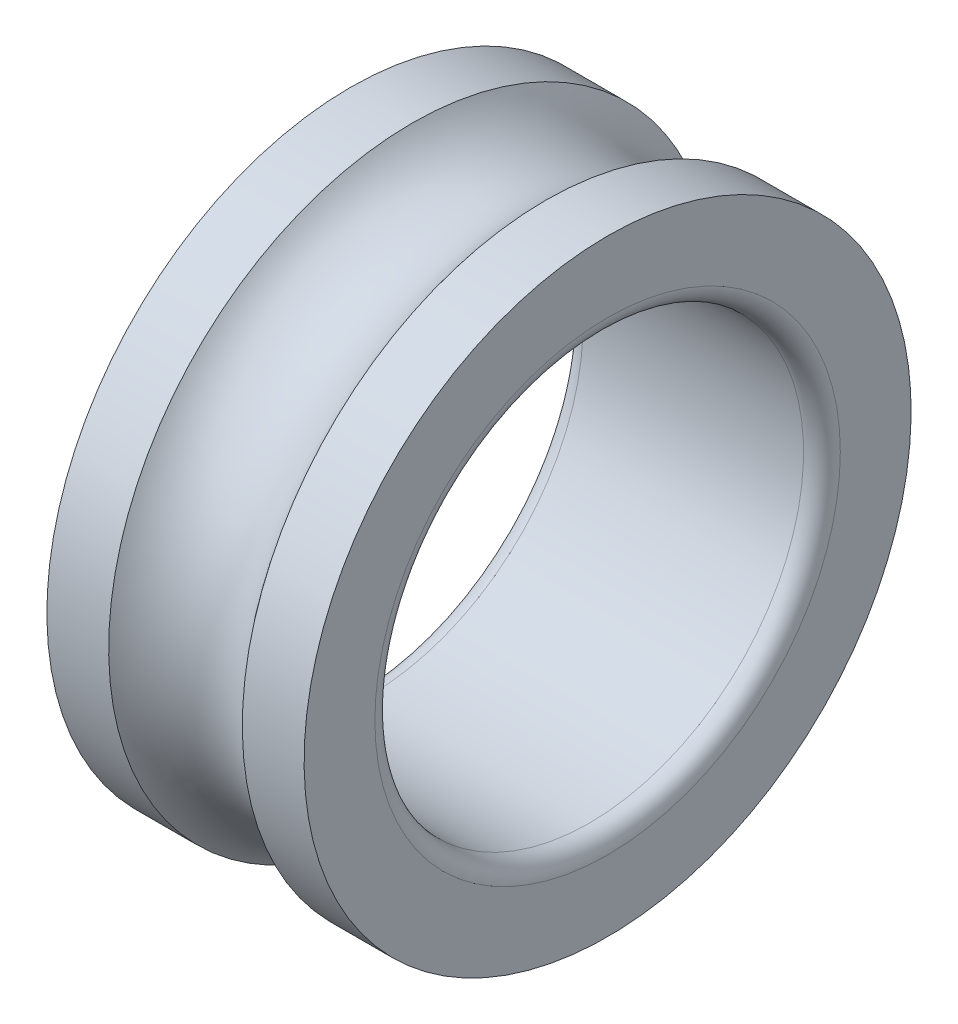
ISO-10303-21;
HEADER;
FILE_DESCRIPTION(('STEP AP214'),'2;1');
FILE_NAME('part.step','',(''),(''),'','','');
FILE_SCHEMA(('AUTOMOTIVE_DESIGN { 1 0 10303 214 1 1 1 1 }'));
ENDSEC;
DATA;
#1=APPLICATION_CONTEXT('core data for automotive mechanical design processes');
#2=APPLICATION_PROTOCOL_DEFINITION('international standard','automotive_design',2000,#1);
#3=PRODUCT_CONTEXT('',#1,'mechanical');
#4=PRODUCT('Part','Part','',(#3));
#5=PRODUCT_RELATED_PRODUCT_CATEGORY('part','',(#4));
#6=PRODUCT_DEFINITION_FORMATION('','',#4);
#7=PRODUCT_DEFINITION_CONTEXT('part definition',#1,'design');
#8=PRODUCT_DEFINITION('design','',#6,#7);
#9=PRODUCT_DEFINITION_SHAPE('','',#8);
#10=(LENGTH_UNIT() NAMED_UNIT(*) SI_UNIT(.MILLI.,.METRE.));
#11=(NAMED_UNIT(*) PLANE_ANGLE_UNIT() SI_UNIT($,.RADIAN.));
#12=(NAMED_UNIT(*) SI_UNIT($,.STERADIAN.) SOLID_ANGLE_UNIT());
#13=UNCERTAINTY_MEASURE_WITH_UNIT(LENGTH_MEASURE(1.E-05),#10,'distance_accuracy_value','');
#14=(GEOMETRIC_REPRESENTATION_CONTEXT(3) GLOBAL_UNCERTAINTY_ASSIGNED_CONTEXT((#13)) GLOBAL_UNIT_ASSIGNED_CONTEXT((#10,
#11,#12)) REPRESENTATION_CONTEXT('',''));
#15=CARTESIAN_POINT('',(0.,0.,0.));
#16=DIRECTION('',(0.,0.,1.));
#17=DIRECTION('',(1.,0.,0.));
#18=AXIS2_PLACEMENT_3D('',#15,#16,#17);
#19=CARTESIAN_POINT('',(18.4776871613145,0.,0.));
#20=DIRECTION('',(-1.,0.,0.));
#21=DIRECTION('',(0.,1.,0.));
#22=AXIS2_PLACEMENT_3D('',#19,#20,#21);
#23=CYLINDRICAL_SURFACE('',#22,24.78);
#24=CARTESIAN_POINT('',(15.955374322629,0.,0.));
#25=DIRECTION('',(1.,0.,0.));
#26=DIRECTION('',(0.,1.,0.));
#27=AXIS2_PLACEMENT_3D('',#24,#25,#26);
#28=CIRCLE('',#27,24.78);
#29=CARTESIAN_POINT('',(15.955374322629,24.78,0.));
#30=VERTEX_POINT('',#29);
#31=EDGE_CURVE('E11',#30,#30,#28,.T.);
#32=ORIENTED_EDGE('',*,*,#31,.T.);
#33=EDGE_LOOP('',(#32));
#34=FACE_BOUND('',#33,.T.);
#35=CARTESIAN_POINT('',(21.,0.,0.));
#36=DIRECTION('',(1.,0.,0.));
#37=DIRECTION('',(0.,1.,0.));
#38=AXIS2_PLACEMENT_3D('',#35,#36,#37);
#39=CIRCLE('',#38,24.78);
#40=CARTESIAN_POINT('',(21.,24.78,0.));
#41=VERTEX_POINT('',#40);
#42=EDGE_CURVE('E21',#41,#41,#39,.T.);
#43=ORIENTED_EDGE('',*,*,#42,.F.);
#44=EDGE_LOOP('',(#43));
#45=FACE_BOUND('',#44,.T.);
#46=ADVANCED_FACE('F17',(#34,#45),#23,.T.);
#47=CARTESIAN_POINT('',(10.5,0.,0.));
#48=DIRECTION('',(1.,0.,0.));
#49=DIRECTION('',(0.,0.,-1.));
#50=AXIS2_PLACEMENT_3D('',#47,#48,#49);
#51=TOROIDAL_SURFACE('',#50,28.75,6.747);
#52=CARTESIAN_POINT('',(5.04462567737098,0.,0.));
#53=DIRECTION('',(1.,0.,0.));
#54=DIRECTION('',(0.,1.,0.));
#55=AXIS2_PLACEMENT_3D('',#52,#53,#54);
#56=CIRCLE('',#55,24.78);
#57=CARTESIAN_POINT('',(5.04462567737098,24.78,0.));
#58=VERTEX_POINT('',#57);
#59=EDGE_CURVE('E26',#58,#58,#56,.T.);
#60=ORIENTED_EDGE('',*,*,#59,.T.);
#61=EDGE_LOOP('',(#60));
#62=FACE_BOUND('',#61,.T.);
#63=ORIENTED_EDGE('',*,*,#31,.F.);
#64=EDGE_LOOP('',(#63));
#65=FACE_BOUND('',#64,.T.);
#66=ADVANCED_FACE('F83',(#62,#65),#51,.F.);
#67=CARTESIAN_POINT('',(2.52231283868549,0.,0.));
#68=DIRECTION('',(-1.,0.,0.));
#69=DIRECTION('',(0.,1.,0.));
#70=AXIS2_PLACEMENT_3D('',#67,#68,#69);
#71=CYLINDRICAL_SURFACE('',#70,24.78);
#72=CARTESIAN_POINT('',(0.,0.,0.));
#73=DIRECTION('',(1.,0.,0.));
#74=DIRECTION('',(0.,1.,0.));
#75=AXIS2_PLACEMENT_3D('',#72,#73,#74);
#76=CIRCLE('',#75,24.78);
#77=CARTESIAN_POINT('',(0.,24.78,0.));
#78=VERTEX_POINT('',#77);
#79=EDGE_CURVE('E68',#78,#78,#76,.T.);
#80=ORIENTED_EDGE('',*,*,#79,.T.);
#81=EDGE_LOOP('',(#80));
#82=FACE_BOUND('',#81,.T.);
#83=ORIENTED_EDGE('',*,*,#59,.F.);
#84=EDGE_LOOP('',(#83));
#85=FACE_BOUND('',#84,.T.);
#86=ADVANCED_FACE('F88',(#82,#85),#71,.T.);
#87=CARTESIAN_POINT('',(0.,21.89,0.));
#88=DIRECTION('',(-1.,0.,0.));
#89=DIRECTION('',(0.,-1.,0.));
#90=AXIS2_PLACEMENT_3D('',#87,#88,#89);
#91=PLANE('',#90);
#92=CARTESIAN_POINT('',(0.,0.,0.));
#93=DIRECTION('',(1.,0.,0.));
#94=DIRECTION('',(0.,1.,0.));
#95=AXIS2_PLACEMENT_3D('',#92,#93,#94);
#96=CIRCLE('',#95,19.);
#97=CARTESIAN_POINT('',(0.,19.,0.));
#98=VERTEX_POINT('',#97);
#99=EDGE_CURVE('E49',#98,#98,#96,.T.);
#100=ORIENTED_EDGE('',*,*,#99,.T.);
#101=EDGE_LOOP('',(#100));
#102=FACE_BOUND('',#101,.T.);
#103=ORIENTED_EDGE('',*,*,#79,.F.);
#104=EDGE_LOOP('',(#103));
#105=FACE_BOUND('',#104,.T.);
#106=ADVANCED_FACE('F92',(#102,#105),#91,.T.);
#107=CARTESIAN_POINT('',(1.5,0.,0.));
#108=DIRECTION('',(1.,0.,0.));
#109=DIRECTION('',(0.,0.,-1.));
#110=AXIS2_PLACEMENT_3D('',#107,#108,#109);
#111=TOROIDAL_SURFACE('',#110,19.,1.5);
#112=CARTESIAN_POINT('',(1.5,0.,0.));
#113=DIRECTION('',(1.,0.,0.));
#114=DIRECTION('',(0.,1.,0.));
#115=AXIS2_PLACEMENT_3D('',#112,#113,#114);
#116=CIRCLE('',#115,17.5);
#117=CARTESIAN_POINT('',(1.5,17.5,0.));
#118=VERTEX_POINT('',#117);
#119=EDGE_CURVE('E54',#118,#118,#116,.T.);
#120=ORIENTED_EDGE('',*,*,#119,.T.);
#121=EDGE_LOOP('',(#120));
#122=FACE_BOUND('',#121,.T.);
#123=ORIENTED_EDGE('',*,*,#99,.F.);
#124=EDGE_LOOP('',(#123));
#125=FACE_BOUND('',#124,.T.);
#126=ADVANCED_FACE('F95',(#122,#125),#111,.T.);
#127=CARTESIAN_POINT('',(10.5,0.,0.));
#128=DIRECTION('',(-1.,0.,0.));
#129=DIRECTION('',(0.,1.,0.));
#130=AXIS2_PLACEMENT_3D('',#127,#128,#129);
#131=CYLINDRICAL_SURFACE('',#130,17.5);
#132=CARTESIAN_POINT('',(19.5,0.,0.));
#133=DIRECTION('',(1.,0.,0.));
#134=DIRECTION('',(0.,1.,0.));
#135=AXIS2_PLACEMENT_3D('',#132,#133,#134);
#136=CIRCLE('',#135,17.5);
#137=CARTESIAN_POINT('',(19.5,17.5,0.));
#138=VERTEX_POINT('',#137);
#139=EDGE_CURVE('E59',#138,#138,#136,.T.);
#140=ORIENTED_EDGE('',*,*,#139,.T.);
#141=EDGE_LOOP('',(#140));
#142=FACE_BOUND('',#141,.T.);
#143=ORIENTED_EDGE('',*,*,#119,.F.);
#144=EDGE_LOOP('',(#143));
#145=FACE_BOUND('',#144,.T.);
#146=ADVANCED_FACE('F60',(#142,#145),#131,.F.);
#147=CARTESIAN_POINT('',(19.5,0.,0.));
#148=DIRECTION('',(1.,0.,0.));
#149=DIRECTION('',(0.,0.,-1.));
#150=AXIS2_PLACEMENT_3D('',#147,#148,#149);
#151=TOROIDAL_SURFACE('',#150,19.,1.5);
#152=CARTESIAN_POINT('',(21.,0.,0.));
#153=DIRECTION('',(1.,0.,0.));
#154=DIRECTION('',(0.,1.,0.));
#155=AXIS2_PLACEMENT_3D('',#152,#153,#154);
#156=CIRCLE('',#155,19.);
#157=CARTESIAN_POINT('',(21.,19.,0.));
#158=VERTEX_POINT('',#157);
#159=EDGE_CURVE('E65',#158,#158,#156,.T.);
#160=ORIENTED_EDGE('',*,*,#159,.T.);
#161=EDGE_LOOP('',(#160));
#162=FACE_BOUND('',#161,.T.);
#163=ORIENTED_EDGE('',*,*,#139,.F.);
#164=EDGE_LOOP('',(#163));
#165=FACE_BOUND('',#164,.T.);
#166=ADVANCED_FACE('F73',(#162,#165),#151,.T.);
#167=CARTESIAN_POINT('',(21.,21.89,0.));
#168=DIRECTION('',(1.,0.,0.));
#169=DIRECTION('',(0.,1.,0.));
#170=AXIS2_PLACEMENT_3D('',#167,#168,#169);
#171=PLANE('',#170);
#172=ORIENTED_EDGE('',*,*,#42,.T.);
#173=EDGE_LOOP('',(#172));
#174=FACE_BOUND('',#173,.T.);
#175=ORIENTED_EDGE('',*,*,#159,.F.);
#176=EDGE_LOOP('',(#175));
#177=FACE_BOUND('',#176,.T.);
#178=ADVANCED_FACE('F19',(#174,#177),#171,.T.);
#179=CLOSED_SHELL('',(#46,#66,#86,#106,#126,#146,#166,#178));
#180=MANIFOLD_SOLID_BREP('B1',#179);
#181=ADVANCED_BREP_SHAPE_REPRESENTATION('',(#18,#180),#14);
#182=SHAPE_DEFINITION_REPRESENTATION(#9,#181);
ENDSEC;
END-ISO-10303-21;
